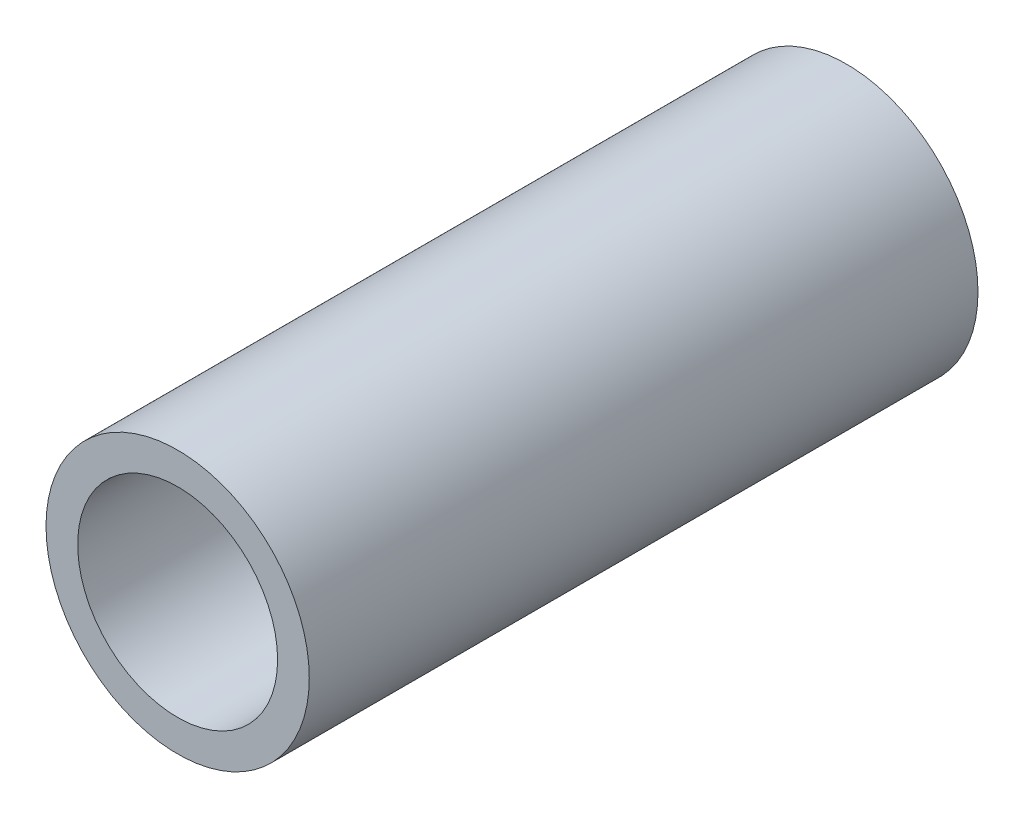
ISO-10303-21;
HEADER;
FILE_DESCRIPTION(('STEP AP214'),'2;1');
FILE_NAME('part.step','',(''),(''),'','','');
FILE_SCHEMA(('AUTOMOTIVE_DESIGN { 1 0 10303 214 1 1 1 1 }'));
ENDSEC;
DATA;
#1=APPLICATION_CONTEXT('core data for automotive mechanical design processes');
#2=APPLICATION_PROTOCOL_DEFINITION('international standard','automotive_design',2000,#1);
#3=PRODUCT_CONTEXT('',#1,'mechanical');
#4=PRODUCT('Part','Part','',(#3));
#5=PRODUCT_RELATED_PRODUCT_CATEGORY('part','',(#4));
#6=PRODUCT_DEFINITION_FORMATION('','',#4);
#7=PRODUCT_DEFINITION_CONTEXT('part definition',#1,'design');
#8=PRODUCT_DEFINITION('design','',#6,#7);
#9=PRODUCT_DEFINITION_SHAPE('','',#8);
#10=(LENGTH_UNIT() NAMED_UNIT(*) SI_UNIT(.MILLI.,.METRE.));
#11=(NAMED_UNIT(*) PLANE_ANGLE_UNIT() SI_UNIT($,.RADIAN.));
#12=(NAMED_UNIT(*) SI_UNIT($,.STERADIAN.) SOLID_ANGLE_UNIT());
#13=UNCERTAINTY_MEASURE_WITH_UNIT(LENGTH_MEASURE(1.E-05),#10,'distance_accuracy_value','');
#14=(GEOMETRIC_REPRESENTATION_CONTEXT(3) GLOBAL_UNCERTAINTY_ASSIGNED_CONTEXT((#13)) GLOBAL_UNIT_ASSIGNED_CONTEXT((#10,
#11,#12)) REPRESENTATION_CONTEXT('',''));
#15=CARTESIAN_POINT('',(0.,0.,0.));
#16=DIRECTION('',(0.,0.,1.));
#17=DIRECTION('',(1.,0.,0.));
#18=AXIS2_PLACEMENT_3D('',#15,#16,#17);
#19=CARTESIAN_POINT('',(0.,0.,12.7));
#20=DIRECTION('',(0.,0.,-1.));
#21=DIRECTION('',(-1.,0.,0.));
#22=AXIS2_PLACEMENT_3D('',#19,#20,#21);
#23=CYLINDRICAL_SURFACE('',#22,2.5);
#24=CARTESIAN_POINT('',(0.,0.,12.7));
#25=DIRECTION('',(0.,0.,1.));
#26=DIRECTION('',(1.,0.,0.));
#27=AXIS2_PLACEMENT_3D('',#24,#25,#26);
#28=CIRCLE('',#27,2.5);
#29=CARTESIAN_POINT('',(2.5,0.,12.7));
#30=VERTEX_POINT('',#29);
#31=EDGE_CURVE('E10',#30,#30,#28,.T.);
#32=ORIENTED_EDGE('',*,*,#31,.F.);
#33=EDGE_LOOP('',(#32));
#34=FACE_BOUND('',#33,.T.);
#35=CARTESIAN_POINT('',(0.,0.,0.));
#36=DIRECTION('',(0.,0.,1.));
#37=DIRECTION('',(1.,0.,0.));
#38=AXIS2_PLACEMENT_3D('',#35,#36,#37);
#39=CIRCLE('',#38,2.5);
#40=CARTESIAN_POINT('',(2.5,0.,0.));
#41=VERTEX_POINT('',#40);
#42=EDGE_CURVE('E36',#41,#41,#39,.T.);
#43=ORIENTED_EDGE('',*,*,#42,.T.);
#44=EDGE_LOOP('',(#43));
#45=FACE_BOUND('',#44,.T.);
#46=ADVANCED_FACE('F33',(#34,#45),#23,.T.);
#47=CARTESIAN_POINT('',(0.,0.,12.7));
#48=DIRECTION('',(0.,0.,1.));
#49=DIRECTION('',(1.,0.,0.));
#50=AXIS2_PLACEMENT_3D('',#47,#48,#49);
#51=PLANE('',#50);
#52=CARTESIAN_POINT('',(0.,0.,12.7));
#53=DIRECTION('',(0.,0.,1.));
#54=DIRECTION('',(1.,0.,0.));
#55=AXIS2_PLACEMENT_3D('',#52,#53,#54);
#56=CIRCLE('',#55,1.89865);
#57=CARTESIAN_POINT('',(1.89865,0.,12.7));
#58=VERTEX_POINT('',#57);
#59=EDGE_CURVE('E47',#58,#58,#56,.T.);
#60=ORIENTED_EDGE('',*,*,#59,.F.);
#61=EDGE_LOOP('',(#60));
#62=FACE_BOUND('',#61,.T.);
#63=ORIENTED_EDGE('',*,*,#31,.T.);
#64=EDGE_LOOP('',(#63));
#65=FACE_BOUND('',#64,.T.);
#66=ADVANCED_FACE('F53',(#62,#65),#51,.T.);
#67=CARTESIAN_POINT('',(0.,0.,0.));
#68=DIRECTION('',(0.,0.,1.));
#69=DIRECTION('',(1.,0.,0.));
#70=AXIS2_PLACEMENT_3D('',#67,#68,#69);
#71=PLANE('',#70);
#72=CARTESIAN_POINT('',(0.,0.,0.));
#73=DIRECTION('',(0.,0.,1.));
#74=DIRECTION('',(1.,0.,0.));
#75=AXIS2_PLACEMENT_3D('',#72,#73,#74);
#76=CIRCLE('',#75,1.89865);
#77=CARTESIAN_POINT('',(1.89865,0.,0.));
#78=VERTEX_POINT('',#77);
#79=EDGE_CURVE('E43',#78,#78,#76,.T.);
#80=ORIENTED_EDGE('',*,*,#79,.T.);
#81=EDGE_LOOP('',(#80));
#82=FACE_BOUND('',#81,.T.);
#83=ORIENTED_EDGE('',*,*,#42,.F.);
#84=EDGE_LOOP('',(#83));
#85=FACE_BOUND('',#84,.T.);
#86=ADVANCED_FACE('F55',(#82,#85),#71,.F.);
#87=CARTESIAN_POINT('',(0.,0.,12.7));
#88=DIRECTION('',(0.,0.,1.));
#89=DIRECTION('',(1.,0.,0.));
#90=AXIS2_PLACEMENT_3D('',#87,#88,#89);
#91=CYLINDRICAL_SURFACE('',#90,1.89865);
#92=ORIENTED_EDGE('',*,*,#79,.F.);
#93=EDGE_LOOP('',(#92));
#94=FACE_BOUND('',#93,.T.);
#95=ORIENTED_EDGE('',*,*,#59,.T.);
#96=EDGE_LOOP('',(#95));
#97=FACE_BOUND('',#96,.T.);
#98=ADVANCED_FACE('F51',(#94,#97),#91,.F.);
#99=CLOSED_SHELL('',(#46,#66,#86,#98));
#100=MANIFOLD_SOLID_BREP('B2',#99);
#101=ADVANCED_BREP_SHAPE_REPRESENTATION('',(#18,#100),#14);
#102=SHAPE_DEFINITION_REPRESENTATION(#9,#101);
ENDSEC;
END-ISO-10303-21;
